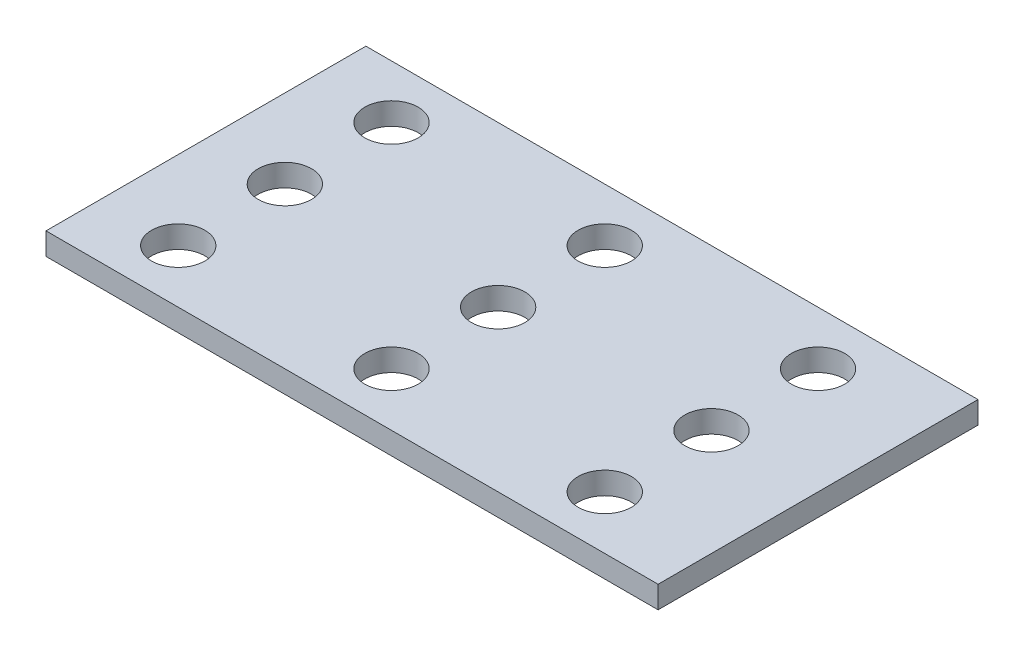
ISO-10303-21;
HEADER;
FILE_DESCRIPTION(('STEP AP214'),'2;1');
FILE_NAME('part.step','',(''),(''),'','','');
FILE_SCHEMA(('AUTOMOTIVE_DESIGN { 1 0 10303 214 1 1 1 1 }'));
ENDSEC;
DATA;
#1=APPLICATION_CONTEXT('core data for automotive mechanical design processes');
#2=APPLICATION_PROTOCOL_DEFINITION('international standard','automotive_design',2000,#1);
#3=PRODUCT_CONTEXT('',#1,'mechanical');
#4=PRODUCT('Part','Part','',(#3));
#5=PRODUCT_RELATED_PRODUCT_CATEGORY('part','',(#4));
#6=PRODUCT_DEFINITION_FORMATION('','',#4);
#7=PRODUCT_DEFINITION_CONTEXT('part definition',#1,'design');
#8=PRODUCT_DEFINITION('design','',#6,#7);
#9=PRODUCT_DEFINITION_SHAPE('','',#8);
#10=(LENGTH_UNIT() NAMED_UNIT(*) SI_UNIT(.MILLI.,.METRE.));
#11=(NAMED_UNIT(*) PLANE_ANGLE_UNIT() SI_UNIT($,.RADIAN.));
#12=(NAMED_UNIT(*) SI_UNIT($,.STERADIAN.) SOLID_ANGLE_UNIT());
#13=UNCERTAINTY_MEASURE_WITH_UNIT(LENGTH_MEASURE(1.E-05),#10,'distance_accuracy_value','');
#14=(GEOMETRIC_REPRESENTATION_CONTEXT(3) GLOBAL_UNCERTAINTY_ASSIGNED_CONTEXT((#13)) GLOBAL_UNIT_ASSIGNED_CONTEXT((#10,
#11,#12)) REPRESENTATION_CONTEXT('',''));
#15=CARTESIAN_POINT('',(0.,0.,0.));
#16=DIRECTION('',(0.,0.,1.));
#17=DIRECTION('',(1.,0.,0.));
#18=AXIS2_PLACEMENT_3D('',#15,#16,#17);
#19=CARTESIAN_POINT('',(0.,1.04,0.));
#20=DIRECTION('',(0.,1.,0.));
#21=DIRECTION('',(0.,0.,1.));
#22=AXIS2_PLACEMENT_3D('',#19,#20,#21);
#23=PLANE('',#22);
#24=CARTESIAN_POINT('',(-10.,1.04,-15.));
#25=DIRECTION('',(0.,1.,0.));
#26=DIRECTION('',(0.,0.,1.));
#27=AXIS2_PLACEMENT_3D('',#24,#25,#26);
#28=CIRCLE('',#27,2.5);
#29=CARTESIAN_POINT('',(-10.,1.04,-12.5));
#30=VERTEX_POINT('',#29);
#31=EDGE_CURVE('E151',#30,#30,#28,.T.);
#32=ORIENTED_EDGE('',*,*,#31,.F.);
#33=EDGE_LOOP('',(#32));
#34=FACE_BOUND('',#33,.T.);
#35=CARTESIAN_POINT('',(-30.,1.04,-5.));
#36=DIRECTION('',(0.,1.,0.));
#37=DIRECTION('',(0.,0.,1.));
#38=AXIS2_PLACEMENT_3D('',#35,#36,#37);
#39=CIRCLE('',#38,2.5);
#40=CARTESIAN_POINT('',(-30.,1.04,-2.5));
#41=VERTEX_POINT('',#40);
#42=EDGE_CURVE('E139',#41,#41,#39,.T.);
#43=ORIENTED_EDGE('',*,*,#42,.F.);
#44=EDGE_LOOP('',(#43));
#45=FACE_BOUND('',#44,.T.);
#46=CARTESIAN_POINT('',(-30.,1.04,-25.));
#47=DIRECTION('',(0.,1.,0.));
#48=DIRECTION('',(0.,0.,1.));
#49=AXIS2_PLACEMENT_3D('',#46,#47,#48);
#50=CIRCLE('',#49,2.5);
#51=CARTESIAN_POINT('',(-30.,1.04,-22.5));
#52=VERTEX_POINT('',#51);
#53=EDGE_CURVE('E127',#52,#52,#50,.T.);
#54=ORIENTED_EDGE('',*,*,#53,.F.);
#55=EDGE_LOOP('',(#54));
#56=FACE_BOUND('',#55,.T.);
#57=CARTESIAN_POINT('',(-50.,1.04,-15.));
#58=DIRECTION('',(0.,1.,0.));
#59=DIRECTION('',(0.,0.,1.));
#60=AXIS2_PLACEMENT_3D('',#57,#58,#59);
#61=CIRCLE('',#60,2.5);
#62=CARTESIAN_POINT('',(-50.,1.04,-12.5));
#63=VERTEX_POINT('',#62);
#64=EDGE_CURVE('E115',#63,#63,#61,.T.);
#65=ORIENTED_EDGE('',*,*,#64,.F.);
#66=EDGE_LOOP('',(#65));
#67=FACE_BOUND('',#66,.T.);
#68=DIRECTION('',(0.,0.,-1.));
#69=VECTOR('',#68,1.);
#70=CARTESIAN_POINT('',(0.,1.04,0.));
#71=LINE('',#70,#69);
#72=CARTESIAN_POINT('',(0.,1.04,0.));
#73=VERTEX_POINT('',#72);
#74=CARTESIAN_POINT('',(0.,1.04,-30.));
#75=VERTEX_POINT('',#74);
#76=EDGE_CURVE('E85',#73,#75,#71,.T.);
#77=ORIENTED_EDGE('',*,*,#76,.T.);
#78=DIRECTION('',(-1.,0.,0.));
#79=VECTOR('',#78,1.);
#80=CARTESIAN_POINT('',(0.,1.04,-30.));
#81=LINE('',#80,#79);
#82=CARTESIAN_POINT('',(-57.4,1.04,-30.));
#83=VERTEX_POINT('',#82);
#84=EDGE_CURVE('E80',#75,#83,#81,.T.);
#85=ORIENTED_EDGE('',*,*,#84,.T.);
#86=DIRECTION('',(0.,0.,1.));
#87=VECTOR('',#86,1.);
#88=CARTESIAN_POINT('',(-57.4,1.04,0.));
#89=LINE('',#88,#87);
#90=CARTESIAN_POINT('',(-57.4,1.04,0.));
#91=VERTEX_POINT('',#90);
#92=EDGE_CURVE('E83',#83,#91,#89,.T.);
#93=ORIENTED_EDGE('',*,*,#92,.T.);
#94=DIRECTION('',(1.,0.,0.));
#95=VECTOR('',#94,1.);
#96=CARTESIAN_POINT('',(0.,1.04,0.));
#97=LINE('',#96,#95);
#98=EDGE_CURVE('E50',#91,#73,#97,.T.);
#99=ORIENTED_EDGE('',*,*,#98,.T.);
#100=EDGE_LOOP('',(#77,#85,#93,#99));
#101=FACE_BOUND('',#100,.T.);
#102=CARTESIAN_POINT('',(-50.,1.04,-25.));
#103=DIRECTION('',(0.,1.,0.));
#104=DIRECTION('',(0.,0.,1.));
#105=AXIS2_PLACEMENT_3D('',#102,#103,#104);
#106=CIRCLE('',#105,2.5);
#107=CARTESIAN_POINT('',(-50.,1.04,-22.5));
#108=VERTEX_POINT('',#107);
#109=EDGE_CURVE('E100',#108,#108,#106,.T.);
#110=ORIENTED_EDGE('',*,*,#109,.F.);
#111=EDGE_LOOP('',(#110));
#112=FACE_BOUND('',#111,.T.);
#113=CARTESIAN_POINT('',(-50.,1.04,-5.));
#114=DIRECTION('',(0.,1.,0.));
#115=DIRECTION('',(0.,0.,1.));
#116=AXIS2_PLACEMENT_3D('',#113,#114,#115);
#117=CIRCLE('',#116,2.5);
#118=CARTESIAN_POINT('',(-50.,1.04,-2.5));
#119=VERTEX_POINT('',#118);
#120=EDGE_CURVE('E121',#119,#119,#117,.T.);
#121=ORIENTED_EDGE('',*,*,#120,.F.);
#122=EDGE_LOOP('',(#121));
#123=FACE_BOUND('',#122,.T.);
#124=CARTESIAN_POINT('',(-30.,1.04,-15.));
#125=DIRECTION('',(0.,1.,0.));
#126=DIRECTION('',(0.,0.,1.));
#127=AXIS2_PLACEMENT_3D('',#124,#125,#126);
#128=CIRCLE('',#127,2.5);
#129=CARTESIAN_POINT('',(-30.,1.04,-12.5));
#130=VERTEX_POINT('',#129);
#131=EDGE_CURVE('E133',#130,#130,#128,.T.);
#132=ORIENTED_EDGE('',*,*,#131,.F.);
#133=EDGE_LOOP('',(#132));
#134=FACE_BOUND('',#133,.T.);
#135=CARTESIAN_POINT('',(-10.,1.04,-25.));
#136=DIRECTION('',(0.,1.,0.));
#137=DIRECTION('',(0.,0.,1.));
#138=AXIS2_PLACEMENT_3D('',#135,#136,#137);
#139=CIRCLE('',#138,2.5);
#140=CARTESIAN_POINT('',(-10.,1.04,-22.5));
#141=VERTEX_POINT('',#140);
#142=EDGE_CURVE('E145',#141,#141,#139,.T.);
#143=ORIENTED_EDGE('',*,*,#142,.F.);
#144=EDGE_LOOP('',(#143));
#145=FACE_BOUND('',#144,.T.);
#146=CARTESIAN_POINT('',(-10.,1.04,-5.));
#147=DIRECTION('',(0.,1.,0.));
#148=DIRECTION('',(0.,0.,1.));
#149=AXIS2_PLACEMENT_3D('',#146,#147,#148);
#150=CIRCLE('',#149,2.5);
#151=CARTESIAN_POINT('',(-10.,1.04,-2.5));
#152=VERTEX_POINT('',#151);
#153=EDGE_CURVE('E157',#152,#152,#150,.T.);
#154=ORIENTED_EDGE('',*,*,#153,.F.);
#155=EDGE_LOOP('',(#154));
#156=FACE_BOUND('',#155,.T.);
#157=ADVANCED_FACE('F33',(#34,#45,#56,#67,#101,#112,#123,#134,#145,#156),#23,.T.);
#158=CARTESIAN_POINT('',(0.,-1.04,0.));
#159=DIRECTION('',(0.,1.,0.));
#160=DIRECTION('',(0.,0.,1.));
#161=AXIS2_PLACEMENT_3D('',#158,#159,#160);
#162=PLANE('',#161);
#163=DIRECTION('',(0.,0.,-1.));
#164=VECTOR('',#163,1.);
#165=CARTESIAN_POINT('',(0.,-1.04,0.));
#166=LINE('',#165,#164);
#167=CARTESIAN_POINT('',(0.,-1.04,0.));
#168=VERTEX_POINT('',#167);
#169=CARTESIAN_POINT('',(0.,-1.04,-30.));
#170=VERTEX_POINT('',#169);
#171=EDGE_CURVE('E97',#168,#170,#166,.T.);
#172=ORIENTED_EDGE('',*,*,#171,.F.);
#173=DIRECTION('',(1.,0.,0.));
#174=VECTOR('',#173,1.);
#175=CARTESIAN_POINT('',(0.,-1.04,0.));
#176=LINE('',#175,#174);
#177=CARTESIAN_POINT('',(-57.4,-1.04,0.));
#178=VERTEX_POINT('',#177);
#179=EDGE_CURVE('E73',#178,#168,#176,.T.);
#180=ORIENTED_EDGE('',*,*,#179,.F.);
#181=DIRECTION('',(0.,0.,1.));
#182=VECTOR('',#181,1.);
#183=CARTESIAN_POINT('',(-57.4,-1.04,0.));
#184=LINE('',#183,#182);
#185=CARTESIAN_POINT('',(-57.4,-1.04,-30.));
#186=VERTEX_POINT('',#185);
#187=EDGE_CURVE('E67',#186,#178,#184,.T.);
#188=ORIENTED_EDGE('',*,*,#187,.F.);
#189=DIRECTION('',(-1.,0.,0.));
#190=VECTOR('',#189,1.);
#191=CARTESIAN_POINT('',(0.,-1.04,-30.));
#192=LINE('',#191,#190);
#193=EDGE_CURVE('E89',#170,#186,#192,.T.);
#194=ORIENTED_EDGE('',*,*,#193,.F.);
#195=EDGE_LOOP('',(#172,#180,#188,#194));
#196=FACE_BOUND('',#195,.T.);
#197=CARTESIAN_POINT('',(-50.,-1.04,-25.));
#198=DIRECTION('',(0.,1.,0.));
#199=DIRECTION('',(0.,0.,1.));
#200=AXIS2_PLACEMENT_3D('',#197,#198,#199);
#201=CIRCLE('',#200,2.5);
#202=CARTESIAN_POINT('',(-50.,-1.04,-22.5));
#203=VERTEX_POINT('',#202);
#204=EDGE_CURVE('E112',#203,#203,#201,.T.);
#205=ORIENTED_EDGE('',*,*,#204,.T.);
#206=EDGE_LOOP('',(#205));
#207=FACE_BOUND('',#206,.T.);
#208=CARTESIAN_POINT('',(-50.,-1.04,-15.));
#209=DIRECTION('',(0.,1.,0.));
#210=DIRECTION('',(0.,0.,1.));
#211=AXIS2_PLACEMENT_3D('',#208,#209,#210);
#212=CIRCLE('',#211,2.5);
#213=CARTESIAN_POINT('',(-50.,-1.04,-12.5));
#214=VERTEX_POINT('',#213);
#215=EDGE_CURVE('E118',#214,#214,#212,.T.);
#216=ORIENTED_EDGE('',*,*,#215,.T.);
#217=EDGE_LOOP('',(#216));
#218=FACE_BOUND('',#217,.T.);
#219=CARTESIAN_POINT('',(-50.,-1.04,-5.));
#220=DIRECTION('',(0.,1.,0.));
#221=DIRECTION('',(0.,0.,1.));
#222=AXIS2_PLACEMENT_3D('',#219,#220,#221);
#223=CIRCLE('',#222,2.5);
#224=CARTESIAN_POINT('',(-50.,-1.04,-2.5));
#225=VERTEX_POINT('',#224);
#226=EDGE_CURVE('E124',#225,#225,#223,.T.);
#227=ORIENTED_EDGE('',*,*,#226,.T.);
#228=EDGE_LOOP('',(#227));
#229=FACE_BOUND('',#228,.T.);
#230=CARTESIAN_POINT('',(-30.,-1.04,-25.));
#231=DIRECTION('',(0.,1.,0.));
#232=DIRECTION('',(0.,0.,1.));
#233=AXIS2_PLACEMENT_3D('',#230,#231,#232);
#234=CIRCLE('',#233,2.5);
#235=CARTESIAN_POINT('',(-30.,-1.04,-22.5));
#236=VERTEX_POINT('',#235);
#237=EDGE_CURVE('E130',#236,#236,#234,.T.);
#238=ORIENTED_EDGE('',*,*,#237,.T.);
#239=EDGE_LOOP('',(#238));
#240=FACE_BOUND('',#239,.T.);
#241=CARTESIAN_POINT('',(-30.,-1.04,-15.));
#242=DIRECTION('',(0.,1.,0.));
#243=DIRECTION('',(0.,0.,1.));
#244=AXIS2_PLACEMENT_3D('',#241,#242,#243);
#245=CIRCLE('',#244,2.5);
#246=CARTESIAN_POINT('',(-30.,-1.04,-12.5));
#247=VERTEX_POINT('',#246);
#248=EDGE_CURVE('E136',#247,#247,#245,.T.);
#249=ORIENTED_EDGE('',*,*,#248,.T.);
#250=EDGE_LOOP('',(#249));
#251=FACE_BOUND('',#250,.T.);
#252=CARTESIAN_POINT('',(-30.,-1.04,-5.));
#253=DIRECTION('',(0.,1.,0.));
#254=DIRECTION('',(0.,0.,1.));
#255=AXIS2_PLACEMENT_3D('',#252,#253,#254);
#256=CIRCLE('',#255,2.5);
#257=CARTESIAN_POINT('',(-30.,-1.04,-2.5));
#258=VERTEX_POINT('',#257);
#259=EDGE_CURVE('E142',#258,#258,#256,.T.);
#260=ORIENTED_EDGE('',*,*,#259,.T.);
#261=EDGE_LOOP('',(#260));
#262=FACE_BOUND('',#261,.T.);
#263=CARTESIAN_POINT('',(-10.,-1.04,-25.));
#264=DIRECTION('',(0.,1.,0.));
#265=DIRECTION('',(0.,0.,1.));
#266=AXIS2_PLACEMENT_3D('',#263,#264,#265);
#267=CIRCLE('',#266,2.5);
#268=CARTESIAN_POINT('',(-10.,-1.04,-22.5));
#269=VERTEX_POINT('',#268);
#270=EDGE_CURVE('E148',#269,#269,#267,.T.);
#271=ORIENTED_EDGE('',*,*,#270,.T.);
#272=EDGE_LOOP('',(#271));
#273=FACE_BOUND('',#272,.T.);
#274=CARTESIAN_POINT('',(-10.,-1.04,-15.));
#275=DIRECTION('',(0.,1.,0.));
#276=DIRECTION('',(0.,0.,1.));
#277=AXIS2_PLACEMENT_3D('',#274,#275,#276);
#278=CIRCLE('',#277,2.5);
#279=CARTESIAN_POINT('',(-10.,-1.04,-12.5));
#280=VERTEX_POINT('',#279);
#281=EDGE_CURVE('E154',#280,#280,#278,.T.);
#282=ORIENTED_EDGE('',*,*,#281,.T.);
#283=EDGE_LOOP('',(#282));
#284=FACE_BOUND('',#283,.T.);
#285=CARTESIAN_POINT('',(-10.,-1.04,-5.));
#286=DIRECTION('',(0.,1.,0.));
#287=DIRECTION('',(0.,0.,1.));
#288=AXIS2_PLACEMENT_3D('',#285,#286,#287);
#289=CIRCLE('',#288,2.5);
#290=CARTESIAN_POINT('',(-10.,-1.04,-2.5));
#291=VERTEX_POINT('',#290);
#292=EDGE_CURVE('E160',#291,#291,#289,.T.);
#293=ORIENTED_EDGE('',*,*,#292,.T.);
#294=EDGE_LOOP('',(#293));
#295=FACE_BOUND('',#294,.T.);
#296=ADVANCED_FACE('F108',(#196,#207,#218,#229,#240,#251,#262,#273,#284,#295),#162,.F.);
#297=CARTESIAN_POINT('',(0.,1.04,0.));
#298=DIRECTION('',(-1.,0.,0.));
#299=DIRECTION('',(0.,0.,1.));
#300=AXIS2_PLACEMENT_3D('',#297,#298,#299);
#301=PLANE('',#300);
#302=ORIENTED_EDGE('',*,*,#171,.T.);
#303=DIRECTION('',(0.,-1.,0.));
#304=VECTOR('',#303,1.);
#305=CARTESIAN_POINT('',(0.,1.04,-30.));
#306=LINE('',#305,#304);
#307=EDGE_CURVE('E11',#75,#170,#306,.T.);
#308=ORIENTED_EDGE('',*,*,#307,.F.);
#309=ORIENTED_EDGE('',*,*,#76,.F.);
#310=DIRECTION('',(0.,-1.,0.));
#311=VECTOR('',#310,1.);
#312=CARTESIAN_POINT('',(0.,1.04,0.));
#313=LINE('',#312,#311);
#314=EDGE_CURVE('E93',#73,#168,#313,.T.);
#315=ORIENTED_EDGE('',*,*,#314,.T.);
#316=EDGE_LOOP('',(#302,#308,#309,#315));
#317=FACE_BOUND('',#316,.T.);
#318=ADVANCED_FACE('F35',(#317),#301,.F.);
#319=CARTESIAN_POINT('',(0.,1.04,-30.));
#320=DIRECTION('',(0.,0.,1.));
#321=DIRECTION('',(1.,0.,0.));
#322=AXIS2_PLACEMENT_3D('',#319,#320,#321);
#323=PLANE('',#322);
#324=ORIENTED_EDGE('',*,*,#193,.T.);
#325=DIRECTION('',(0.,-1.,0.));
#326=VECTOR('',#325,1.);
#327=CARTESIAN_POINT('',(-57.4,1.04,-30.));
#328=LINE('',#327,#326);
#329=EDGE_CURVE('E42',#83,#186,#328,.T.);
#330=ORIENTED_EDGE('',*,*,#329,.F.);
#331=ORIENTED_EDGE('',*,*,#84,.F.);
#332=ORIENTED_EDGE('',*,*,#307,.T.);
#333=EDGE_LOOP('',(#324,#330,#331,#332));
#334=FACE_BOUND('',#333,.T.);
#335=ADVANCED_FACE('F88',(#334),#323,.F.);
#336=CARTESIAN_POINT('',(-57.4,1.04,0.));
#337=DIRECTION('',(1.,0.,0.));
#338=DIRECTION('',(0.,0.,-1.));
#339=AXIS2_PLACEMENT_3D('',#336,#337,#338);
#340=PLANE('',#339);
#341=ORIENTED_EDGE('',*,*,#187,.T.);
#342=DIRECTION('',(0.,-1.,0.));
#343=VECTOR('',#342,1.);
#344=CARTESIAN_POINT('',(-57.4,1.04,0.));
#345=LINE('',#344,#343);
#346=EDGE_CURVE('E90',#91,#178,#345,.T.);
#347=ORIENTED_EDGE('',*,*,#346,.F.);
#348=ORIENTED_EDGE('',*,*,#92,.F.);
#349=ORIENTED_EDGE('',*,*,#329,.T.);
#350=EDGE_LOOP('',(#341,#347,#348,#349));
#351=FACE_BOUND('',#350,.T.);
#352=ADVANCED_FACE('F91',(#351),#340,.F.);
#353=CARTESIAN_POINT('',(0.,1.04,0.));
#354=DIRECTION('',(0.,0.,-1.));
#355=DIRECTION('',(-1.,0.,0.));
#356=AXIS2_PLACEMENT_3D('',#353,#354,#355);
#357=PLANE('',#356);
#358=ORIENTED_EDGE('',*,*,#179,.T.);
#359=ORIENTED_EDGE('',*,*,#314,.F.);
#360=ORIENTED_EDGE('',*,*,#98,.F.);
#361=ORIENTED_EDGE('',*,*,#346,.T.);
#362=EDGE_LOOP('',(#358,#359,#360,#361));
#363=FACE_BOUND('',#362,.T.);
#364=ADVANCED_FACE('F105',(#363),#357,.F.);
#365=CARTESIAN_POINT('',(-50.,1.04,-25.));
#366=DIRECTION('',(0.,-1.,0.));
#367=DIRECTION('',(0.,0.,-1.));
#368=AXIS2_PLACEMENT_3D('',#365,#366,#367);
#369=CYLINDRICAL_SURFACE('',#368,2.5);
#370=ORIENTED_EDGE('',*,*,#109,.T.);
#371=EDGE_LOOP('',(#370));
#372=FACE_BOUND('',#371,.T.);
#373=ORIENTED_EDGE('',*,*,#204,.F.);
#374=EDGE_LOOP('',(#373));
#375=FACE_BOUND('',#374,.T.);
#376=ADVANCED_FACE('F179',(#372,#375),#369,.F.);
#377=CARTESIAN_POINT('',(-50.,1.04,-15.));
#378=DIRECTION('',(0.,-1.,0.));
#379=DIRECTION('',(0.,0.,-1.));
#380=AXIS2_PLACEMENT_3D('',#377,#378,#379);
#381=CYLINDRICAL_SURFACE('',#380,2.5);
#382=ORIENTED_EDGE('',*,*,#64,.T.);
#383=EDGE_LOOP('',(#382));
#384=FACE_BOUND('',#383,.T.);
#385=ORIENTED_EDGE('',*,*,#215,.F.);
#386=EDGE_LOOP('',(#385));
#387=FACE_BOUND('',#386,.T.);
#388=ADVANCED_FACE('F225',(#384,#387),#381,.F.);
#389=CARTESIAN_POINT('',(-50.,1.04,-5.));
#390=DIRECTION('',(0.,-1.,0.));
#391=DIRECTION('',(0.,0.,-1.));
#392=AXIS2_PLACEMENT_3D('',#389,#390,#391);
#393=CYLINDRICAL_SURFACE('',#392,2.5);
#394=ORIENTED_EDGE('',*,*,#120,.T.);
#395=EDGE_LOOP('',(#394));
#396=FACE_BOUND('',#395,.T.);
#397=ORIENTED_EDGE('',*,*,#226,.F.);
#398=EDGE_LOOP('',(#397));
#399=FACE_BOUND('',#398,.T.);
#400=ADVANCED_FACE('F233',(#396,#399),#393,.F.);
#401=CARTESIAN_POINT('',(-30.,1.04,-25.));
#402=DIRECTION('',(0.,-1.,0.));
#403=DIRECTION('',(0.,0.,-1.));
#404=AXIS2_PLACEMENT_3D('',#401,#402,#403);
#405=CYLINDRICAL_SURFACE('',#404,2.5);
#406=ORIENTED_EDGE('',*,*,#53,.T.);
#407=EDGE_LOOP('',(#406));
#408=FACE_BOUND('',#407,.T.);
#409=ORIENTED_EDGE('',*,*,#237,.F.);
#410=EDGE_LOOP('',(#409));
#411=FACE_BOUND('',#410,.T.);
#412=ADVANCED_FACE('F241',(#408,#411),#405,.F.);
#413=CARTESIAN_POINT('',(-30.,1.04,-15.));
#414=DIRECTION('',(0.,-1.,0.));
#415=DIRECTION('',(0.,0.,-1.));
#416=AXIS2_PLACEMENT_3D('',#413,#414,#415);
#417=CYLINDRICAL_SURFACE('',#416,2.5);
#418=ORIENTED_EDGE('',*,*,#131,.T.);
#419=EDGE_LOOP('',(#418));
#420=FACE_BOUND('',#419,.T.);
#421=ORIENTED_EDGE('',*,*,#248,.F.);
#422=EDGE_LOOP('',(#421));
#423=FACE_BOUND('',#422,.T.);
#424=ADVANCED_FACE('F250',(#420,#423),#417,.F.);
#425=CARTESIAN_POINT('',(-30.,1.04,-5.));
#426=DIRECTION('',(0.,-1.,0.));
#427=DIRECTION('',(0.,0.,-1.));
#428=AXIS2_PLACEMENT_3D('',#425,#426,#427);
#429=CYLINDRICAL_SURFACE('',#428,2.5);
#430=ORIENTED_EDGE('',*,*,#42,.T.);
#431=EDGE_LOOP('',(#430));
#432=FACE_BOUND('',#431,.T.);
#433=ORIENTED_EDGE('',*,*,#259,.F.);
#434=EDGE_LOOP('',(#433));
#435=FACE_BOUND('',#434,.T.);
#436=ADVANCED_FACE('F259',(#432,#435),#429,.F.);
#437=CARTESIAN_POINT('',(-10.,1.04,-25.));
#438=DIRECTION('',(0.,-1.,0.));
#439=DIRECTION('',(0.,0.,-1.));
#440=AXIS2_PLACEMENT_3D('',#437,#438,#439);
#441=CYLINDRICAL_SURFACE('',#440,2.5);
#442=ORIENTED_EDGE('',*,*,#142,.T.);
#443=EDGE_LOOP('',(#442));
#444=FACE_BOUND('',#443,.T.);
#445=ORIENTED_EDGE('',*,*,#270,.F.);
#446=EDGE_LOOP('',(#445));
#447=FACE_BOUND('',#446,.T.);
#448=ADVANCED_FACE('F268',(#444,#447),#441,.F.);
#449=CARTESIAN_POINT('',(-10.,1.04,-15.));
#450=DIRECTION('',(0.,-1.,0.));
#451=DIRECTION('',(0.,0.,-1.));
#452=AXIS2_PLACEMENT_3D('',#449,#450,#451);
#453=CYLINDRICAL_SURFACE('',#452,2.5);
#454=ORIENTED_EDGE('',*,*,#31,.T.);
#455=EDGE_LOOP('',(#454));
#456=FACE_BOUND('',#455,.T.);
#457=ORIENTED_EDGE('',*,*,#281,.F.);
#458=EDGE_LOOP('',(#457));
#459=FACE_BOUND('',#458,.T.);
#460=ADVANCED_FACE('F277',(#456,#459),#453,.F.);
#461=CARTESIAN_POINT('',(-10.,1.04,-5.));
#462=DIRECTION('',(0.,-1.,0.));
#463=DIRECTION('',(0.,0.,-1.));
#464=AXIS2_PLACEMENT_3D('',#461,#462,#463);
#465=CYLINDRICAL_SURFACE('',#464,2.5);
#466=ORIENTED_EDGE('',*,*,#153,.T.);
#467=EDGE_LOOP('',(#466));
#468=FACE_BOUND('',#467,.T.);
#469=ORIENTED_EDGE('',*,*,#292,.F.);
#470=EDGE_LOOP('',(#469));
#471=FACE_BOUND('',#470,.T.);
#472=ADVANCED_FACE('F166',(#468,#471),#465,.F.);
#473=CLOSED_SHELL('',(#157,#296,#318,#335,#352,#364,#376,#388,#400,#412,#424,#436,#448,#460,#472));
#474=MANIFOLD_SOLID_BREP('B2',#473);
#475=ADVANCED_BREP_SHAPE_REPRESENTATION('',(#18,#474),#14);
#476=SHAPE_DEFINITION_REPRESENTATION(#9,#475);
ENDSEC;
END-ISO-10303-21;
